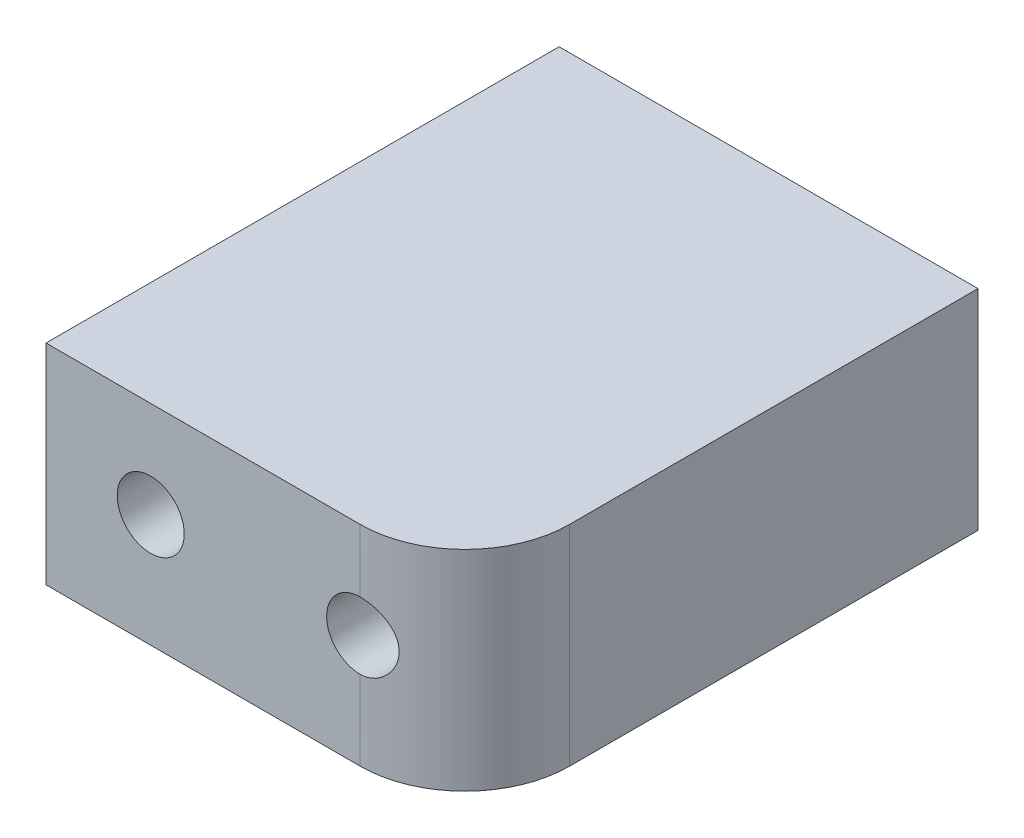
ISO-10303-21;
HEADER;
FILE_DESCRIPTION(('STEP AP214'),'2;1');
FILE_NAME('part.step','',(''),(''),'','','');
FILE_SCHEMA(('AUTOMOTIVE_DESIGN { 1 0 10303 214 1 1 1 1 }'));
ENDSEC;
DATA;
#1=APPLICATION_CONTEXT('core data for automotive mechanical design processes');
#2=APPLICATION_PROTOCOL_DEFINITION('international standard','automotive_design',2000,#1);
#3=PRODUCT_CONTEXT('',#1,'mechanical');
#4=PRODUCT('Part','Part','',(#3));
#5=PRODUCT_RELATED_PRODUCT_CATEGORY('part','',(#4));
#6=PRODUCT_DEFINITION_FORMATION('','',#4);
#7=PRODUCT_DEFINITION_CONTEXT('part definition',#1,'design');
#8=PRODUCT_DEFINITION('design','',#6,#7);
#9=PRODUCT_DEFINITION_SHAPE('','',#8);
#10=(LENGTH_UNIT() NAMED_UNIT(*) SI_UNIT(.MILLI.,.METRE.));
#11=(NAMED_UNIT(*) PLANE_ANGLE_UNIT() SI_UNIT($,.RADIAN.));
#12=(NAMED_UNIT(*) SI_UNIT($,.STERADIAN.) SOLID_ANGLE_UNIT());
#13=UNCERTAINTY_MEASURE_WITH_UNIT(LENGTH_MEASURE(1.E-05),#10,'distance_accuracy_value','');
#14=(GEOMETRIC_REPRESENTATION_CONTEXT(3) GLOBAL_UNCERTAINTY_ASSIGNED_CONTEXT((#13)) GLOBAL_UNIT_ASSIGNED_CONTEXT((#10,
#11,#12)) REPRESENTATION_CONTEXT('',''));
#15=CARTESIAN_POINT('',(0.,0.,0.));
#16=DIRECTION('',(0.,0.,1.));
#17=DIRECTION('',(1.,0.,0.));
#18=AXIS2_PLACEMENT_3D('',#15,#16,#17);
#19=CARTESIAN_POINT('',(0.,0.,24.5));
#20=DIRECTION('',(0.,0.,1.));
#21=DIRECTION('',(1.,0.,0.));
#22=AXIS2_PLACEMENT_3D('',#19,#20,#21);
#23=PLANE('',#22);
#24=CARTESIAN_POINT('',(-5.,0.400000000000012,24.5));
#25=DIRECTION('',(0.,0.,1.));
#26=DIRECTION('',(1.,0.,0.));
#27=AXIS2_PLACEMENT_3D('',#24,#25,#26);
#28=CIRCLE('',#27,1.6);
#29=CARTESIAN_POINT('',(-3.4,0.400000000000012,24.5));
#30=VERTEX_POINT('',#29);
#31=EDGE_CURVE('E119',#30,#30,#28,.T.);
#32=ORIENTED_EDGE('',*,*,#31,.F.);
#33=EDGE_LOOP('',(#32));
#34=FACE_BOUND('',#33,.T.);
#35=DIRECTION('',(1.,0.,0.));
#36=VECTOR('',#35,1.);
#37=CARTESIAN_POINT('',(-10.,-4.99999999999999,24.5));
#38=LINE('',#37,#36);
#39=CARTESIAN_POINT('',(-10.,-4.99999999999999,24.5));
#40=VERTEX_POINT('',#39);
#41=CARTESIAN_POINT('',(5.,-4.99999999999999,24.5));
#42=VERTEX_POINT('',#41);
#43=EDGE_CURVE('E110',#40,#42,#38,.T.);
#44=ORIENTED_EDGE('',*,*,#43,.T.);
#45=DIRECTION('',(0.,1.,0.));
#46=VECTOR('',#45,1.);
#47=CARTESIAN_POINT('',(5.,5.,24.5));
#48=LINE('',#47,#46);
#49=CARTESIAN_POINT('',(5.,-1.19999999999999,24.5));
#50=VERTEX_POINT('',#49);
#51=EDGE_CURVE('E129',#42,#50,#48,.T.);
#52=ORIENTED_EDGE('',*,*,#51,.T.);
#53=CARTESIAN_POINT('',(5.,0.400000000000014,24.5));
#54=DIRECTION('',(0.,0.,1.));
#55=DIRECTION('',(-1.,0.,0.));
#56=AXIS2_PLACEMENT_3D('',#53,#54,#55);
#57=CIRCLE('',#56,1.6);
#58=CARTESIAN_POINT('',(5.,2.00000000000001,24.5));
#59=VERTEX_POINT('',#58);
#60=EDGE_CURVE('E171',#59,#50,#57,.T.);
#61=ORIENTED_EDGE('',*,*,#60,.F.);
#62=DIRECTION('',(0.,1.,0.));
#63=VECTOR('',#62,1.);
#64=CARTESIAN_POINT('',(5.,5.,24.5));
#65=LINE('',#64,#63);
#66=CARTESIAN_POINT('',(5.,5.,24.5));
#67=VERTEX_POINT('',#66);
#68=EDGE_CURVE('E94',#59,#67,#65,.T.);
#69=ORIENTED_EDGE('',*,*,#68,.T.);
#70=DIRECTION('',(-1.,0.,0.));
#71=VECTOR('',#70,1.);
#72=CARTESIAN_POINT('',(-10.,5.00000000000001,24.5));
#73=LINE('',#72,#71);
#74=CARTESIAN_POINT('',(-10.,5.00000000000001,24.5));
#75=VERTEX_POINT('',#74);
#76=EDGE_CURVE('E86',#67,#75,#73,.T.);
#77=ORIENTED_EDGE('',*,*,#76,.T.);
#78=DIRECTION('',(0.,-1.,0.));
#79=VECTOR('',#78,1.);
#80=CARTESIAN_POINT('',(-10.,5.00000000000001,24.5));
#81=LINE('',#80,#79);
#82=EDGE_CURVE('E90',#75,#40,#81,.T.);
#83=ORIENTED_EDGE('',*,*,#82,.T.);
#84=EDGE_LOOP('',(#44,#52,#61,#69,#77,#83));
#85=FACE_BOUND('',#84,.T.);
#86=ADVANCED_FACE('F35',(#34,#85),#23,.T.);
#87=CARTESIAN_POINT('',(0.,0.,0.));
#88=DIRECTION('',(0.,0.,1.));
#89=DIRECTION('',(1.,0.,0.));
#90=AXIS2_PLACEMENT_3D('',#87,#88,#89);
#91=PLANE('',#90);
#92=DIRECTION('',(0.,1.,0.));
#93=VECTOR('',#92,1.);
#94=CARTESIAN_POINT('',(10.,5.,0.));
#95=LINE('',#94,#93);
#96=CARTESIAN_POINT('',(10.,-4.99999999999999,0.));
#97=VERTEX_POINT('',#96);
#98=CARTESIAN_POINT('',(10.,5.,0.));
#99=VERTEX_POINT('',#98);
#100=EDGE_CURVE('E116',#97,#99,#95,.T.);
#101=ORIENTED_EDGE('',*,*,#100,.F.);
#102=DIRECTION('',(1.,0.,0.));
#103=VECTOR('',#102,1.);
#104=CARTESIAN_POINT('',(-10.,-4.99999999999999,0.));
#105=LINE('',#104,#103);
#106=CARTESIAN_POINT('',(-10.,-4.99999999999999,0.));
#107=VERTEX_POINT('',#106);
#108=EDGE_CURVE('E95',#107,#97,#105,.T.);
#109=ORIENTED_EDGE('',*,*,#108,.F.);
#110=DIRECTION('',(0.,-1.,0.));
#111=VECTOR('',#110,1.);
#112=CARTESIAN_POINT('',(-10.,5.00000000000001,0.));
#113=LINE('',#112,#111);
#114=CARTESIAN_POINT('',(-10.,5.00000000000001,0.));
#115=VERTEX_POINT('',#114);
#116=EDGE_CURVE('E121',#115,#107,#113,.T.);
#117=ORIENTED_EDGE('',*,*,#116,.F.);
#118=DIRECTION('',(-1.,0.,0.));
#119=VECTOR('',#118,1.);
#120=CARTESIAN_POINT('',(-10.,5.00000000000001,0.));
#121=LINE('',#120,#119);
#122=EDGE_CURVE('E101',#99,#115,#121,.T.);
#123=ORIENTED_EDGE('',*,*,#122,.F.);
#124=EDGE_LOOP('',(#101,#109,#117,#123));
#125=FACE_BOUND('',#124,.T.);
#126=CARTESIAN_POINT('',(-5.,0.400000000000012,0.));
#127=DIRECTION('',(0.,0.,1.));
#128=DIRECTION('',(1.,0.,0.));
#129=AXIS2_PLACEMENT_3D('',#126,#127,#128);
#130=CIRCLE('',#129,1.6);
#131=CARTESIAN_POINT('',(-3.4,0.400000000000012,0.));
#132=VERTEX_POINT('',#131);
#133=EDGE_CURVE('E173',#132,#132,#130,.T.);
#134=ORIENTED_EDGE('',*,*,#133,.T.);
#135=EDGE_LOOP('',(#134));
#136=FACE_BOUND('',#135,.T.);
#137=CARTESIAN_POINT('',(5.,0.400000000000014,0.));
#138=DIRECTION('',(0.,0.,1.));
#139=DIRECTION('',(-1.,0.,0.));
#140=AXIS2_PLACEMENT_3D('',#137,#138,#139);
#141=CIRCLE('',#140,1.6);
#142=CARTESIAN_POINT('',(3.4,0.400000000000014,0.));
#143=VERTEX_POINT('',#142);
#144=EDGE_CURVE('E174',#143,#143,#141,.T.);
#145=ORIENTED_EDGE('',*,*,#144,.T.);
#146=EDGE_LOOP('',(#145));
#147=FACE_BOUND('',#146,.T.);
#148=ADVANCED_FACE('F151',(#125,#136,#147),#91,.F.);
#149=CARTESIAN_POINT('',(10.,5.,24.5));
#150=DIRECTION('',(-1.,0.,0.));
#151=DIRECTION('',(0.,0.,1.));
#152=AXIS2_PLACEMENT_3D('',#149,#150,#151);
#153=PLANE('',#152);
#154=DIRECTION('',(0.,0.,-1.));
#155=VECTOR('',#154,1.);
#156=CARTESIAN_POINT('',(10.,5.,24.5));
#157=LINE('',#156,#155);
#158=CARTESIAN_POINT('',(10.,5.,19.5));
#159=VERTEX_POINT('',#158);
#160=EDGE_CURVE('E104',#159,#99,#157,.T.);
#161=ORIENTED_EDGE('',*,*,#160,.F.);
#162=DIRECTION('',(0.,1.,0.));
#163=VECTOR('',#162,1.);
#164=CARTESIAN_POINT('',(10.,-4.99999999999999,19.5));
#165=LINE('',#164,#163);
#166=CARTESIAN_POINT('',(10.,-4.99999999999999,19.5));
#167=VERTEX_POINT('',#166);
#168=EDGE_CURVE('E44',#159,#167,#165,.F.);
#169=ORIENTED_EDGE('',*,*,#168,.T.);
#170=DIRECTION('',(0.,0.,-1.));
#171=VECTOR('',#170,1.);
#172=CARTESIAN_POINT('',(10.,-4.99999999999999,24.5));
#173=LINE('',#172,#171);
#174=EDGE_CURVE('E112',#167,#97,#173,.T.);
#175=ORIENTED_EDGE('',*,*,#174,.T.);
#176=ORIENTED_EDGE('',*,*,#100,.T.);
#177=EDGE_LOOP('',(#161,#169,#175,#176));
#178=FACE_BOUND('',#177,.T.);
#179=ADVANCED_FACE('F155',(#178),#153,.F.);
#180=CARTESIAN_POINT('',(-10.,5.00000000000001,24.5));
#181=DIRECTION('',(0.,-1.,0.));
#182=DIRECTION('',(1.,0.,0.));
#183=AXIS2_PLACEMENT_3D('',#180,#181,#182);
#184=PLANE('',#183);
#185=ORIENTED_EDGE('',*,*,#76,.F.);
#186=CARTESIAN_POINT('',(5.,5.,19.5));
#187=DIRECTION('',(0.,-1.,0.));
#188=DIRECTION('',(1.,0.,0.));
#189=AXIS2_PLACEMENT_3D('',#186,#187,#188);
#190=CIRCLE('',#189,5.);
#191=EDGE_CURVE('E58',#67,#159,#190,.F.);
#192=ORIENTED_EDGE('',*,*,#191,.T.);
#193=ORIENTED_EDGE('',*,*,#160,.T.);
#194=ORIENTED_EDGE('',*,*,#122,.T.);
#195=DIRECTION('',(0.,0.,-1.));
#196=VECTOR('',#195,1.);
#197=CARTESIAN_POINT('',(-10.,5.00000000000001,24.5));
#198=LINE('',#197,#196);
#199=EDGE_CURVE('E98',#75,#115,#198,.T.);
#200=ORIENTED_EDGE('',*,*,#199,.F.);
#201=EDGE_LOOP('',(#185,#192,#193,#194,#200));
#202=FACE_BOUND('',#201,.T.);
#203=ADVANCED_FACE('F99',(#202),#184,.F.);
#204=CARTESIAN_POINT('',(-10.,5.00000000000001,24.5));
#205=DIRECTION('',(1.,0.,0.));
#206=DIRECTION('',(0.,1.,0.));
#207=AXIS2_PLACEMENT_3D('',#204,#205,#206);
#208=PLANE('',#207);
#209=ORIENTED_EDGE('',*,*,#116,.T.);
#210=DIRECTION('',(0.,0.,-1.));
#211=VECTOR('',#210,1.);
#212=CARTESIAN_POINT('',(-10.,-4.99999999999999,24.5));
#213=LINE('',#212,#211);
#214=EDGE_CURVE('E105',#40,#107,#213,.T.);
#215=ORIENTED_EDGE('',*,*,#214,.F.);
#216=ORIENTED_EDGE('',*,*,#82,.F.);
#217=ORIENTED_EDGE('',*,*,#199,.T.);
#218=EDGE_LOOP('',(#209,#215,#216,#217));
#219=FACE_BOUND('',#218,.T.);
#220=ADVANCED_FACE('F107',(#219),#208,.F.);
#221=CARTESIAN_POINT('',(-10.,-4.99999999999999,24.5));
#222=DIRECTION('',(0.,1.,0.));
#223=DIRECTION('',(-1.,0.,0.));
#224=AXIS2_PLACEMENT_3D('',#221,#222,#223);
#225=PLANE('',#224);
#226=ORIENTED_EDGE('',*,*,#174,.F.);
#227=CARTESIAN_POINT('',(5.,-4.99999999999999,19.5));
#228=DIRECTION('',(0.,1.,0.));
#229=DIRECTION('',(-1.,0.,0.));
#230=AXIS2_PLACEMENT_3D('',#227,#228,#229);
#231=CIRCLE('',#230,5.);
#232=EDGE_CURVE('E11',#167,#42,#231,.F.);
#233=ORIENTED_EDGE('',*,*,#232,.T.);
#234=ORIENTED_EDGE('',*,*,#43,.F.);
#235=ORIENTED_EDGE('',*,*,#214,.T.);
#236=ORIENTED_EDGE('',*,*,#108,.T.);
#237=EDGE_LOOP('',(#226,#233,#234,#235,#236));
#238=FACE_BOUND('',#237,.T.);
#239=ADVANCED_FACE('F147',(#238),#225,.F.);
#240=CARTESIAN_POINT('',(-5.,0.400000000000012,24.5));
#241=DIRECTION('',(0.,0.,-1.));
#242=DIRECTION('',(-1.,0.,0.));
#243=AXIS2_PLACEMENT_3D('',#240,#241,#242);
#244=CYLINDRICAL_SURFACE('',#243,1.6);
#245=ORIENTED_EDGE('',*,*,#31,.T.);
#246=EDGE_LOOP('',(#245));
#247=FACE_BOUND('',#246,.T.);
#248=ORIENTED_EDGE('',*,*,#133,.F.);
#249=EDGE_LOOP('',(#248));
#250=FACE_BOUND('',#249,.T.);
#251=ADVANCED_FACE('F143',(#247,#250),#244,.F.);
#252=CARTESIAN_POINT('',(5.,0.400000000000014,24.5));
#253=DIRECTION('',(0.,0.,-1.));
#254=DIRECTION('',(-1.,0.,0.));
#255=AXIS2_PLACEMENT_3D('',#252,#253,#254);
#256=CYLINDRICAL_SURFACE('',#255,1.6);
#257=ORIENTED_EDGE('',*,*,#60,.T.);
#258=CARTESIAN_POINT('',(5.,-1.19999999999999,24.5));
#259=CARTESIAN_POINT('',(5.04383043842803,-1.20000092330479,24.5000031252151));
#260=CARTESIAN_POINT('',(5.08763885785938,-1.19819779427419,24.4994229794001));
#261=CARTESIAN_POINT('',(5.17492192632472,-1.19101242680007,24.4971295181682));
#262=CARTESIAN_POINT('',(5.21839664565764,-1.18563096435342,24.4954164484374));
#263=CARTESIAN_POINT('',(5.34761609306446,-1.16421082175473,24.4886431398271));
#264=CARTESIAN_POINT('',(5.43246277380991,-1.14289591285888,24.4819483376354));
#265=CARTESIAN_POINT('',(5.59715108190679,-1.08693829052996,24.4649051997793));
#266=CARTESIAN_POINT('',(5.67699429162578,-1.05229981571739,24.4545580261285));
#267=CARTESIAN_POINT('',(5.82977424875052,-0.970756784429577,24.4312726723352));
#268=CARTESIAN_POINT('',(5.9027078212997,-0.923846626209391,24.4183333095506));
#269=CARTESIAN_POINT('',(6.04189407053834,-0.817517139700776,24.3907710307995));
#270=CARTESIAN_POINT('',(6.1078931327951,-0.757775816528242,24.3761102997388));
#271=CARTESIAN_POINT('',(6.22913124368982,-0.62816038213312,24.3469713655759));
#272=CARTESIAN_POINT('',(6.28436763590706,-0.558283776745469,24.3324932083587));
#273=CARTESIAN_POINT('',(6.38391514905527,-0.408145450199111,24.3049477988914));
#274=CARTESIAN_POINT('',(6.42790320572124,-0.327660138119083,24.291927278977));
#275=CARTESIAN_POINT('',(6.50161047333567,-0.15995378232582,24.2693461516106));
#276=CARTESIAN_POINT('',(6.53133428190555,-0.0727349194923291,24.2597844295712));
#277=CARTESIAN_POINT('',(6.57473112170583,0.103081689969158,24.2456013017783));
#278=CARTESIAN_POINT('',(6.58887867160316,0.191550227135032,24.240834249355));
#279=CARTESIAN_POINT('',(6.6022043450636,0.369725699559406,24.2363483055155));
#280=CARTESIAN_POINT('',(6.60138635646012,0.459432307133866,24.2366281029993));
#281=CARTESIAN_POINT('',(6.58517376254971,0.633566087444099,24.2420762065724));
#282=CARTESIAN_POINT('',(6.57038825206622,0.718057448613423,24.247040233167));
#283=CARTESIAN_POINT('',(6.52765025551944,0.883289795705394,24.2609646795748));
#284=CARTESIAN_POINT('',(6.49969646251486,0.964030408495294,24.2699254960613));
#285=CARTESIAN_POINT('',(6.43099631644414,1.12089821191209,24.2909865895009));
#286=CARTESIAN_POINT('',(6.39006243902181,1.19693689873387,24.303132404525));
#287=CARTESIAN_POINT('',(6.29669439350431,1.34126266544768,24.3291745736968));
#288=CARTESIAN_POINT('',(6.24425722068309,1.40954771295959,24.3430713848102));
#289=CARTESIAN_POINT('',(6.12641111358648,1.53985879197318,24.3718624282449));
#290=CARTESIAN_POINT('',(6.06050209280113,1.60142986808584,24.3867725916751));
#291=CARTESIAN_POINT('',(5.91909362103738,1.71276996668158,24.4153292649267));
#292=CARTESIAN_POINT('',(5.84359170910691,1.76253595127086,24.4289754489291));
#293=CARTESIAN_POINT('',(5.68421952995601,1.84918834523978,24.4536250842471));
#294=CARTESIAN_POINT('',(5.60027999688977,1.88595467707515,24.4646036183017));
#295=CARTESIAN_POINT('',(5.42701620640773,1.94466614770915,24.4824895568105));
#296=CARTESIAN_POINT('',(5.33770006744047,1.96663305043033,24.4894029375337));
#297=CARTESIAN_POINT('',(5.20627783778406,1.98718922674664,24.4959123816704));
#298=CARTESIAN_POINT('',(5.16515434834533,1.99199224740356,24.4974420540221));
#299=CARTESIAN_POINT('',(5.08269433120599,1.99839503995851,24.4994860258861));
#300=CARTESIAN_POINT('',(5.04135820310541,1.99999948702625,24.5000018073286));
#301=CARTESIAN_POINT('',(5.00000000000002,2.00000000000011,24.5));
#302=B_SPLINE_CURVE_WITH_KNOTS('',3,(#258,#259,#260,#261,#262,#263,#264,#265,#266,#267,#268,
#269,#270,#271,#272,#273,#274,#275,#276,#277,#278,#279,#280,#281,#282,#283,#284,#285,#286,#287,
#288,#289,#290,#291,#292,#293,#294,#295,#296,#297,#298,#299,#300,#301),.UNSPECIFIED.,.F.,.F.,(4,
2,2,2,2,2,2,2,2,2,2,2,2,2,2,2,2,2,2,2,2,4),(0.,0.131407246115977,0.262786004565213,
0.524635681611462,0.786402125333489,1.04828826863519,1.31773382711493,1.58724580560039,
1.86379764981619,2.14026029647459,2.40804531489818,2.67576076758211,2.93231563901468,
3.18889597867483,3.44936636933643,3.70990487752512,3.9828921139228,4.25594952417236,
4.53146703430155,4.80657848095848,4.93075688990191,5.05475366099263),.UNSPECIFIED.);
#303=EDGE_CURVE('E132',#50,#59,#302,.T.);
#304=ORIENTED_EDGE('',*,*,#303,.T.);
#305=EDGE_LOOP('',(#257,#304));
#306=FACE_BOUND('',#305,.T.);
#307=ORIENTED_EDGE('',*,*,#144,.F.);
#308=EDGE_LOOP('',(#307));
#309=FACE_BOUND('',#308,.T.);
#310=ADVANCED_FACE('F139',(#306,#309),#256,.F.);
#311=CARTESIAN_POINT('',(5.,0.,19.5));
#312=DIRECTION('',(0.,-1.,0.));
#313=DIRECTION('',(0.,0.,-1.));
#314=AXIS2_PLACEMENT_3D('',#311,#312,#313);
#315=CYLINDRICAL_SURFACE('',#314,5.);
#316=ORIENTED_EDGE('',*,*,#232,.F.);
#317=ORIENTED_EDGE('',*,*,#168,.F.);
#318=ORIENTED_EDGE('',*,*,#191,.F.);
#319=ORIENTED_EDGE('',*,*,#68,.F.);
#320=ORIENTED_EDGE('',*,*,#303,.F.);
#321=ORIENTED_EDGE('',*,*,#51,.F.);
#322=EDGE_LOOP('',(#316,#317,#318,#319,#320,#321));
#323=FACE_BOUND('',#322,.T.);
#324=ADVANCED_FACE('F37',(#323),#315,.T.);
#325=CLOSED_SHELL('',(#86,#148,#179,#203,#220,#239,#251,#310,#324));
#326=MANIFOLD_SOLID_BREP('B2',#325);
#327=ADVANCED_BREP_SHAPE_REPRESENTATION('',(#18,#326),#14);
#328=SHAPE_DEFINITION_REPRESENTATION(#9,#327);
ENDSEC;
END-ISO-10303-21;
